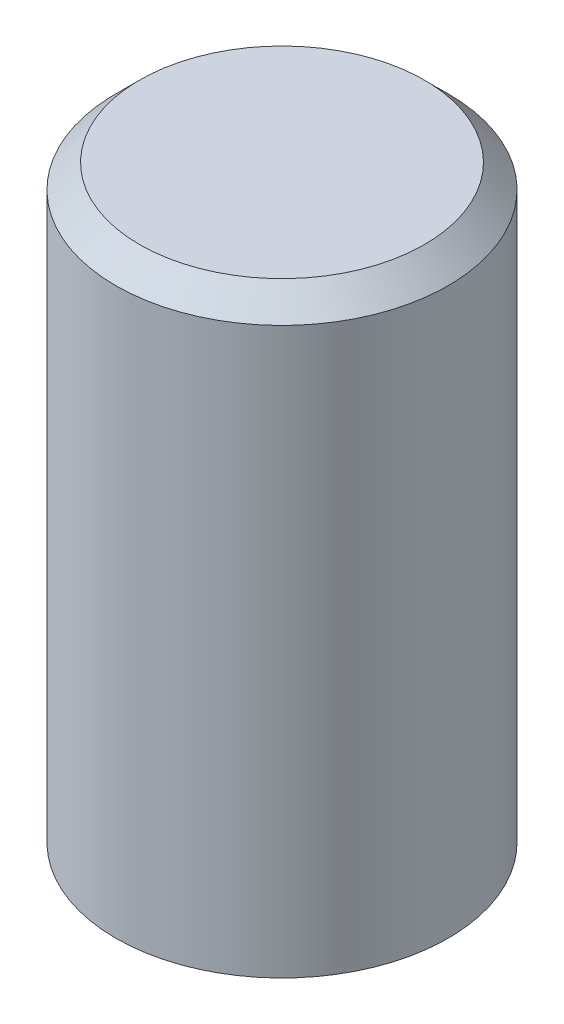
ISO-10303-21;
HEADER;
FILE_DESCRIPTION(('STEP AP214'),'2;1');
FILE_NAME('part.step','',(''),(''),'','','');
FILE_SCHEMA(('AUTOMOTIVE_DESIGN { 1 0 10303 214 1 1 1 1 }'));
ENDSEC;
DATA;
#1=APPLICATION_CONTEXT('core data for automotive mechanical design processes');
#2=APPLICATION_PROTOCOL_DEFINITION('international standard','automotive_design',2000,#1);
#3=PRODUCT_CONTEXT('',#1,'mechanical');
#4=PRODUCT('Part','Part','',(#3));
#5=PRODUCT_RELATED_PRODUCT_CATEGORY('part','',(#4));
#6=PRODUCT_DEFINITION_FORMATION('','',#4);
#7=PRODUCT_DEFINITION_CONTEXT('part definition',#1,'design');
#8=PRODUCT_DEFINITION('design','',#6,#7);
#9=PRODUCT_DEFINITION_SHAPE('','',#8);
#10=(LENGTH_UNIT() NAMED_UNIT(*) SI_UNIT(.MILLI.,.METRE.));
#11=(NAMED_UNIT(*) PLANE_ANGLE_UNIT() SI_UNIT($,.RADIAN.));
#12=(NAMED_UNIT(*) SI_UNIT($,.STERADIAN.) SOLID_ANGLE_UNIT());
#13=UNCERTAINTY_MEASURE_WITH_UNIT(LENGTH_MEASURE(1.E-05),#10,'distance_accuracy_value','');
#14=(GEOMETRIC_REPRESENTATION_CONTEXT(3) GLOBAL_UNCERTAINTY_ASSIGNED_CONTEXT((#13)) GLOBAL_UNIT_ASSIGNED_CONTEXT((#10,
#11,#12)) REPRESENTATION_CONTEXT('',''));
#15=CARTESIAN_POINT('',(0.,0.,0.));
#16=DIRECTION('',(0.,0.,1.));
#17=DIRECTION('',(1.,0.,0.));
#18=AXIS2_PLACEMENT_3D('',#15,#16,#17);
#19=CARTESIAN_POINT('',(0.,-1.,0.));
#20=DIRECTION('',(0.,1.,0.));
#21=DIRECTION('',(0.,0.,1.));
#22=AXIS2_PLACEMENT_3D('',#19,#20,#21);
#23=CYLINDRICAL_SURFACE('',#22,1.75);
#24=CARTESIAN_POINT('',(0.,4.95,0.));
#25=DIRECTION('',(0.,1.,0.));
#26=DIRECTION('',(0.,0.,1.));
#27=AXIS2_PLACEMENT_3D('',#24,#25,#26);
#28=CIRCLE('',#27,1.75);
#29=CARTESIAN_POINT('',(0.,4.95,1.75));
#30=VERTEX_POINT('',#29);
#31=EDGE_CURVE('E10',#30,#30,#28,.F.);
#32=ORIENTED_EDGE('',*,*,#31,.T.);
#33=EDGE_LOOP('',(#32));
#34=FACE_BOUND('',#33,.T.);
#35=CARTESIAN_POINT('',(0.,-1.,0.));
#36=DIRECTION('',(0.,1.,0.));
#37=DIRECTION('',(0.,0.,1.));
#38=AXIS2_PLACEMENT_3D('',#35,#36,#37);
#39=CIRCLE('',#38,1.75);
#40=CARTESIAN_POINT('',(0.,-1.,1.75));
#41=VERTEX_POINT('',#40);
#42=EDGE_CURVE('E40',#41,#41,#39,.T.);
#43=ORIENTED_EDGE('',*,*,#42,.T.);
#44=EDGE_LOOP('',(#43));
#45=FACE_BOUND('',#44,.T.);
#46=ADVANCED_FACE('F29',(#34,#45),#23,.T.);
#47=CARTESIAN_POINT('',(0.,-1.,0.));
#48=DIRECTION('',(0.,1.,0.));
#49=DIRECTION('',(0.,0.,1.));
#50=AXIS2_PLACEMENT_3D('',#47,#48,#49);
#51=PLANE('',#50);
#52=ORIENTED_EDGE('',*,*,#42,.F.);
#53=EDGE_LOOP('',(#52));
#54=FACE_BOUND('',#53,.T.);
#55=ADVANCED_FACE('F48',(#54),#51,.F.);
#56=CARTESIAN_POINT('',(0.,5.2,0.));
#57=DIRECTION('',(0.,1.,0.));
#58=DIRECTION('',(0.,0.,1.));
#59=AXIS2_PLACEMENT_3D('',#56,#57,#58);
#60=PLANE('',#59);
#61=CARTESIAN_POINT('',(0.,5.2,0.));
#62=DIRECTION('',(0.,1.,0.));
#63=DIRECTION('',(0.,0.,1.));
#64=AXIS2_PLACEMENT_3D('',#61,#62,#63);
#65=CIRCLE('',#64,1.5);
#66=CARTESIAN_POINT('',(0.,5.2,1.5));
#67=VERTEX_POINT('',#66);
#68=EDGE_CURVE('E36',#67,#67,#65,.T.);
#69=ORIENTED_EDGE('',*,*,#68,.T.);
#70=EDGE_LOOP('',(#69));
#71=FACE_BOUND('',#70,.T.);
#72=ADVANCED_FACE('F50',(#71),#60,.T.);
#73=CARTESIAN_POINT('',(0.,5.2,0.));
#74=DIRECTION('',(0.,-1.,0.));
#75=DIRECTION('',(0.,0.,-1.));
#76=AXIS2_PLACEMENT_3D('',#73,#74,#75);
#77=CONICAL_SURFACE('',#76,1.5,0.785398163397447);
#78=ORIENTED_EDGE('',*,*,#31,.F.);
#79=EDGE_LOOP('',(#78));
#80=FACE_BOUND('',#79,.T.);
#81=ORIENTED_EDGE('',*,*,#68,.F.);
#82=EDGE_LOOP('',(#81));
#83=FACE_BOUND('',#82,.T.);
#84=ADVANCED_FACE('F31',(#80,#83),#77,.T.);
#85=CLOSED_SHELL('',(#46,#55,#72,#84));
#86=MANIFOLD_SOLID_BREP('B2',#85);
#87=ADVANCED_BREP_SHAPE_REPRESENTATION('',(#18,#86),#14);
#88=SHAPE_DEFINITION_REPRESENTATION(#9,#87);
ENDSEC;
END-ISO-10303-21;
